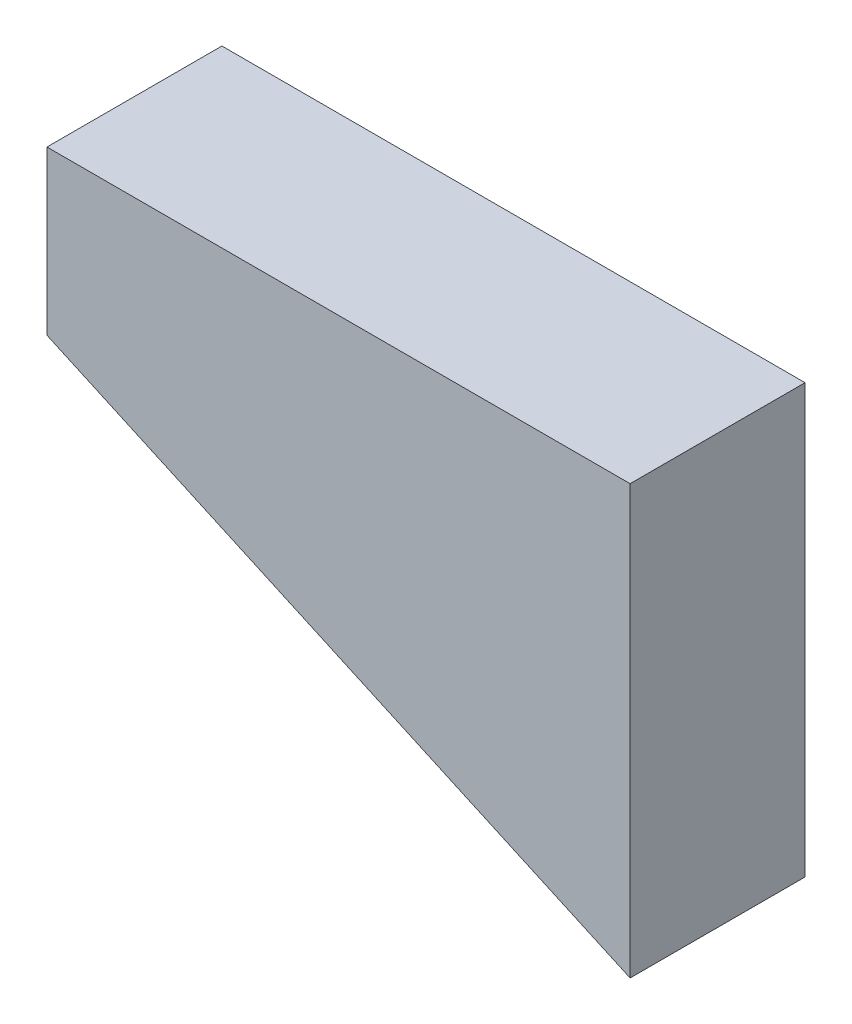
ISO-10303-21;
HEADER;
FILE_DESCRIPTION(('STEP AP214'),'2;1');
FILE_NAME('part.step','',(''),(''),'','','');
FILE_SCHEMA(('AUTOMOTIVE_DESIGN { 1 0 10303 214 1 1 1 1 }'));
ENDSEC;
DATA;
#1=APPLICATION_CONTEXT('core data for automotive mechanical design processes');
#2=APPLICATION_PROTOCOL_DEFINITION('international standard','automotive_design',2000,#1);
#3=PRODUCT_CONTEXT('',#1,'mechanical');
#4=PRODUCT('Part','Part','',(#3));
#5=PRODUCT_RELATED_PRODUCT_CATEGORY('part','',(#4));
#6=PRODUCT_DEFINITION_FORMATION('','',#4);
#7=PRODUCT_DEFINITION_CONTEXT('part definition',#1,'design');
#8=PRODUCT_DEFINITION('design','',#6,#7);
#9=PRODUCT_DEFINITION_SHAPE('','',#8);
#10=(LENGTH_UNIT() NAMED_UNIT(*) SI_UNIT(.MILLI.,.METRE.));
#11=(NAMED_UNIT(*) PLANE_ANGLE_UNIT() SI_UNIT($,.RADIAN.));
#12=(NAMED_UNIT(*) SI_UNIT($,.STERADIAN.) SOLID_ANGLE_UNIT());
#13=UNCERTAINTY_MEASURE_WITH_UNIT(LENGTH_MEASURE(1.E-05),#10,'distance_accuracy_value','');
#14=(GEOMETRIC_REPRESENTATION_CONTEXT(3) GLOBAL_UNCERTAINTY_ASSIGNED_CONTEXT((#13)) GLOBAL_UNIT_ASSIGNED_CONTEXT((#10,
#11,#12)) REPRESENTATION_CONTEXT('',''));
#15=CARTESIAN_POINT('',(0.,0.,0.));
#16=DIRECTION('',(0.,0.,1.));
#17=DIRECTION('',(1.,0.,0.));
#18=AXIS2_PLACEMENT_3D('',#15,#16,#17);
#19=CARTESIAN_POINT('',(-673.684498249528,0.,19.05));
#20=DIRECTION('',(1.,0.,0.));
#21=DIRECTION('',(0.,0.,-1.));
#22=AXIS2_PLACEMENT_3D('',#19,#20,#21);
#23=PLANE('',#22);
#24=DIRECTION('',(0.,-1.,0.));
#25=VECTOR('',#24,1.);
#26=CARTESIAN_POINT('',(-673.684498249528,0.,0.));
#27=LINE('',#26,#25);
#28=CARTESIAN_POINT('',(-673.684498249528,1780.44678718592,0.));
#29=VERTEX_POINT('',#28);
#30=CARTESIAN_POINT('',(-673.684498249528,1733.82952618455,0.));
#31=VERTEX_POINT('',#30);
#32=EDGE_CURVE('E97',#29,#31,#27,.T.);
#33=ORIENTED_EDGE('',*,*,#32,.F.);
#34=DIRECTION('',(0.,0.,-1.));
#35=VECTOR('',#34,1.);
#36=CARTESIAN_POINT('',(-673.684498249528,1780.44678718592,19.05));
#37=LINE('',#36,#35);
#38=CARTESIAN_POINT('',(-673.684498249528,1780.44678718592,19.05));
#39=VERTEX_POINT('',#38);
#40=EDGE_CURVE('E11',#39,#29,#37,.T.);
#41=ORIENTED_EDGE('',*,*,#40,.F.);
#42=DIRECTION('',(0.,-1.,0.));
#43=VECTOR('',#42,1.);
#44=CARTESIAN_POINT('',(-673.684498249528,0.,19.05));
#45=LINE('',#44,#43);
#46=CARTESIAN_POINT('',(-673.684498249528,1733.82952618455,19.05));
#47=VERTEX_POINT('',#46);
#48=EDGE_CURVE('E85',#39,#47,#45,.T.);
#49=ORIENTED_EDGE('',*,*,#48,.T.);
#50=DIRECTION('',(0.,0.,-1.));
#51=VECTOR('',#50,1.);
#52=CARTESIAN_POINT('',(-673.684498249528,1733.82952618455,19.05));
#53=LINE('',#52,#51);
#54=EDGE_CURVE('E74',#47,#31,#53,.T.);
#55=ORIENTED_EDGE('',*,*,#54,.T.);
#56=EDGE_LOOP('',(#33,#41,#49,#55));
#57=FACE_BOUND('',#56,.T.);
#58=ADVANCED_FACE('F35',(#57),#23,.T.);
#59=CARTESIAN_POINT('',(0.,1780.44678718592,19.05));
#60=DIRECTION('',(0.,-1.,0.));
#61=DIRECTION('',(0.,0.,-1.));
#62=AXIS2_PLACEMENT_3D('',#59,#60,#61);
#63=PLANE('',#62);
#64=DIRECTION('',(-1.,0.,0.));
#65=VECTOR('',#64,1.);
#66=CARTESIAN_POINT('',(0.,1780.44678718592,0.));
#67=LINE('',#66,#65);
#68=CARTESIAN_POINT('',(-737.184498249528,1780.44678718592,0.));
#69=VERTEX_POINT('',#68);
#70=EDGE_CURVE('E90',#29,#69,#67,.T.);
#71=ORIENTED_EDGE('',*,*,#70,.T.);
#72=DIRECTION('',(0.,0.,-1.));
#73=VECTOR('',#72,1.);
#74=CARTESIAN_POINT('',(-737.184498249528,1780.44678718592,19.05));
#75=LINE('',#74,#73);
#76=CARTESIAN_POINT('',(-737.184498249528,1780.44678718592,19.05));
#77=VERTEX_POINT('',#76);
#78=EDGE_CURVE('E43',#77,#69,#75,.T.);
#79=ORIENTED_EDGE('',*,*,#78,.F.);
#80=DIRECTION('',(-1.,0.,0.));
#81=VECTOR('',#80,1.);
#82=CARTESIAN_POINT('',(0.,1780.44678718592,19.05));
#83=LINE('',#82,#81);
#84=EDGE_CURVE('E80',#39,#77,#83,.T.);
#85=ORIENTED_EDGE('',*,*,#84,.F.);
#86=ORIENTED_EDGE('',*,*,#40,.T.);
#87=EDGE_LOOP('',(#71,#79,#85,#86));
#88=FACE_BOUND('',#87,.T.);
#89=ADVANCED_FACE('F88',(#88),#63,.F.);
#90=CARTESIAN_POINT('',(-737.184498249528,0.,19.05));
#91=DIRECTION('',(1.,0.,0.));
#92=DIRECTION('',(0.,0.,-1.));
#93=AXIS2_PLACEMENT_3D('',#90,#91,#92);
#94=PLANE('',#93);
#95=DIRECTION('',(0.,-1.,0.));
#96=VECTOR('',#95,1.);
#97=CARTESIAN_POINT('',(-737.184498249528,0.,0.));
#98=LINE('',#97,#96);
#99=CARTESIAN_POINT('',(-737.184498249528,1762.69316254818,0.));
#100=VERTEX_POINT('',#99);
#101=EDGE_CURVE('E67',#69,#100,#98,.T.);
#102=ORIENTED_EDGE('',*,*,#101,.T.);
#103=DIRECTION('',(0.,0.,-1.));
#104=VECTOR('',#103,1.);
#105=CARTESIAN_POINT('',(-737.184498249528,1762.69316254818,19.05));
#106=LINE('',#105,#104);
#107=CARTESIAN_POINT('',(-737.184498249528,1762.69316254818,19.05));
#108=VERTEX_POINT('',#107);
#109=EDGE_CURVE('E91',#108,#100,#106,.T.);
#110=ORIENTED_EDGE('',*,*,#109,.F.);
#111=DIRECTION('',(0.,-1.,0.));
#112=VECTOR('',#111,1.);
#113=CARTESIAN_POINT('',(-737.184498249528,0.,19.05));
#114=LINE('',#113,#112);
#115=EDGE_CURVE('E84',#77,#108,#114,.T.);
#116=ORIENTED_EDGE('',*,*,#115,.F.);
#117=ORIENTED_EDGE('',*,*,#78,.T.);
#118=EDGE_LOOP('',(#102,#110,#116,#117));
#119=FACE_BOUND('',#118,.T.);
#120=ADVANCED_FACE('F92',(#119),#94,.F.);
#121=CARTESIAN_POINT('',(537.798023862408,1183.15565249731,19.05));
#122=DIRECTION('',(0.413802944301181,0.910366477462606,0.));
#123=DIRECTION('',(-0.910366477462606,0.413802944301181,0.));
#124=AXIS2_PLACEMENT_3D('',#121,#122,#123);
#125=PLANE('',#124);
#126=DIRECTION('',(0.910366477462606,-0.413802944301181,0.));
#127=VECTOR('',#126,1.);
#128=CARTESIAN_POINT('',(537.798023862408,1183.15565249731,0.));
#129=LINE('',#128,#127);
#130=EDGE_CURVE('E102',#100,#31,#129,.T.);
#131=ORIENTED_EDGE('',*,*,#130,.T.);
#132=ORIENTED_EDGE('',*,*,#54,.F.);
#133=DIRECTION('',(0.910366477462606,-0.413802944301181,0.));
#134=VECTOR('',#133,1.);
#135=CARTESIAN_POINT('',(537.798023862408,1183.15565249731,19.05));
#136=LINE('',#135,#134);
#137=EDGE_CURVE('E51',#108,#47,#136,.T.);
#138=ORIENTED_EDGE('',*,*,#137,.F.);
#139=ORIENTED_EDGE('',*,*,#109,.T.);
#140=EDGE_LOOP('',(#131,#132,#138,#139));
#141=FACE_BOUND('',#140,.T.);
#142=ADVANCED_FACE('F107',(#141),#125,.F.);
#143=CARTESIAN_POINT('',(0.,0.,19.05));
#144=DIRECTION('',(0.,0.,1.));
#145=DIRECTION('',(1.,0.,0.));
#146=AXIS2_PLACEMENT_3D('',#143,#144,#145);
#147=PLANE('',#146);
#148=ORIENTED_EDGE('',*,*,#48,.F.);
#149=ORIENTED_EDGE('',*,*,#84,.T.);
#150=ORIENTED_EDGE('',*,*,#115,.T.);
#151=ORIENTED_EDGE('',*,*,#137,.T.);
#152=EDGE_LOOP('',(#148,#149,#150,#151));
#153=FACE_BOUND('',#152,.T.);
#154=ADVANCED_FACE('F82',(#153),#147,.T.);
#155=CARTESIAN_POINT('',(0.,0.,0.));
#156=DIRECTION('',(0.,0.,1.));
#157=DIRECTION('',(1.,0.,0.));
#158=AXIS2_PLACEMENT_3D('',#155,#156,#157);
#159=PLANE('',#158);
#160=ORIENTED_EDGE('',*,*,#32,.T.);
#161=ORIENTED_EDGE('',*,*,#130,.F.);
#162=ORIENTED_EDGE('',*,*,#101,.F.);
#163=ORIENTED_EDGE('',*,*,#70,.F.);
#164=EDGE_LOOP('',(#160,#161,#162,#163));
#165=FACE_BOUND('',#164,.T.);
#166=ADVANCED_FACE('F109',(#165),#159,.F.);
#167=CLOSED_SHELL('',(#58,#89,#120,#142,#154,#166));
#168=MANIFOLD_SOLID_BREP('B2',#167);
#169=ADVANCED_BREP_SHAPE_REPRESENTATION('',(#18,#168),#14);
#170=SHAPE_DEFINITION_REPRESENTATION(#9,#169);
ENDSEC;
END-ISO-10303-21;
